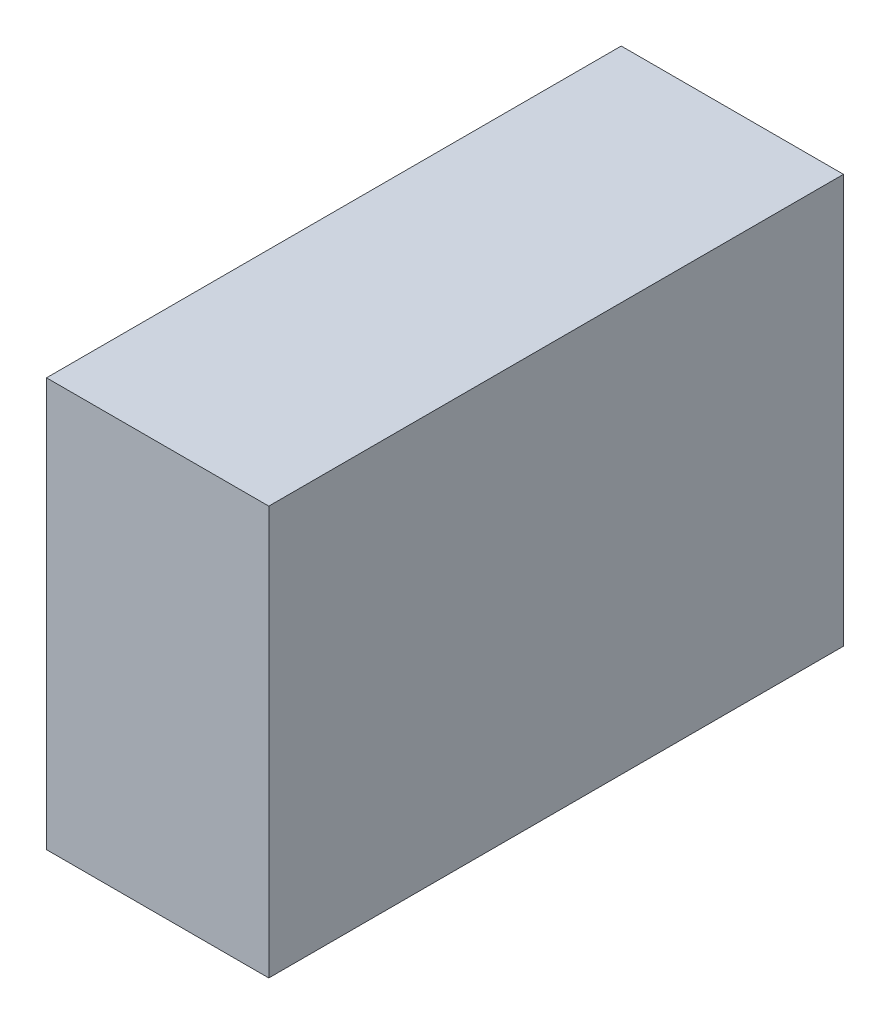
ISO-10303-21;
HEADER;
FILE_DESCRIPTION(('STEP AP214'),'2;1');
FILE_NAME('part.step','',(''),(''),'','','');
FILE_SCHEMA(('AUTOMOTIVE_DESIGN { 1 0 10303 214 1 1 1 1 }'));
ENDSEC;
DATA;
#1=APPLICATION_CONTEXT('core data for automotive mechanical design processes');
#2=APPLICATION_PROTOCOL_DEFINITION('international standard','automotive_design',2000,#1);
#3=PRODUCT_CONTEXT('',#1,'mechanical');
#4=PRODUCT('Part','Part','',(#3));
#5=PRODUCT_RELATED_PRODUCT_CATEGORY('part','',(#4));
#6=PRODUCT_DEFINITION_FORMATION('','',#4);
#7=PRODUCT_DEFINITION_CONTEXT('part definition',#1,'design');
#8=PRODUCT_DEFINITION('design','',#6,#7);
#9=PRODUCT_DEFINITION_SHAPE('','',#8);
#10=(LENGTH_UNIT() NAMED_UNIT(*) SI_UNIT(.MILLI.,.METRE.));
#11=(NAMED_UNIT(*) PLANE_ANGLE_UNIT() SI_UNIT($,.RADIAN.));
#12=(NAMED_UNIT(*) SI_UNIT($,.STERADIAN.) SOLID_ANGLE_UNIT());
#13=UNCERTAINTY_MEASURE_WITH_UNIT(LENGTH_MEASURE(1.E-05),#10,'distance_accuracy_value','');
#14=(GEOMETRIC_REPRESENTATION_CONTEXT(3) GLOBAL_UNCERTAINTY_ASSIGNED_CONTEXT((#13)) GLOBAL_UNIT_ASSIGNED_CONTEXT((#10,
#11,#12)) REPRESENTATION_CONTEXT('',''));
#15=CARTESIAN_POINT('',(0.,0.,0.));
#16=DIRECTION('',(0.,0.,1.));
#17=DIRECTION('',(1.,0.,0.));
#18=AXIS2_PLACEMENT_3D('',#15,#16,#17);
#19=CARTESIAN_POINT('',(12.7,67.8836515493127,-371.38835696242));
#20=DIRECTION('',(0.,0.,1.));
#21=DIRECTION('',(1.,0.,0.));
#22=AXIS2_PLACEMENT_3D('',#19,#20,#21);
#23=PLANE('',#22);
#24=DIRECTION('',(0.,1.,0.));
#25=VECTOR('',#24,1.);
#26=CARTESIAN_POINT('',(-12.7,67.8836515493127,-371.38835696242));
#27=LINE('',#26,#25);
#28=CARTESIAN_POINT('',(-12.7,67.8836515493127,-371.38835696242));
#29=VERTEX_POINT('',#28);
#30=CARTESIAN_POINT('',(-12.7,114.5867289811,-371.38835696242));
#31=VERTEX_POINT('',#30);
#32=EDGE_CURVE('E113',#29,#31,#27,.T.);
#33=ORIENTED_EDGE('',*,*,#32,.T.);
#34=DIRECTION('',(-1.,0.,0.));
#35=VECTOR('',#34,1.);
#36=CARTESIAN_POINT('',(12.7,114.5867289811,-371.38835696242));
#37=LINE('',#36,#35);
#38=CARTESIAN_POINT('',(12.7,114.5867289811,-371.38835696242));
#39=VERTEX_POINT('',#38);
#40=EDGE_CURVE('E11',#39,#31,#37,.T.);
#41=ORIENTED_EDGE('',*,*,#40,.F.);
#42=DIRECTION('',(0.,1.,0.));
#43=VECTOR('',#42,1.);
#44=CARTESIAN_POINT('',(12.7,67.8836515493127,-371.38835696242));
#45=LINE('',#44,#43);
#46=CARTESIAN_POINT('',(12.7,67.8836515493127,-371.38835696242));
#47=VERTEX_POINT('',#46);
#48=EDGE_CURVE('E97',#47,#39,#45,.T.);
#49=ORIENTED_EDGE('',*,*,#48,.F.);
#50=DIRECTION('',(-1.,0.,0.));
#51=VECTOR('',#50,1.);
#52=CARTESIAN_POINT('',(12.7,67.8836515493127,-371.38835696242));
#53=LINE('',#52,#51);
#54=EDGE_CURVE('E109',#47,#29,#53,.T.);
#55=ORIENTED_EDGE('',*,*,#54,.T.);
#56=EDGE_LOOP('',(#33,#41,#49,#55));
#57=FACE_BOUND('',#56,.T.);
#58=ADVANCED_FACE('F45',(#57),#23,.F.);
#59=CARTESIAN_POINT('',(12.7,114.5867289811,-371.38835696242));
#60=DIRECTION('',(0.,-1.,0.));
#61=DIRECTION('',(0.,0.,-1.));
#62=AXIS2_PLACEMENT_3D('',#59,#60,#61);
#63=PLANE('',#62);
#64=DIRECTION('',(0.,0.,1.));
#65=VECTOR('',#64,1.);
#66=CARTESIAN_POINT('',(-12.7,114.5867289811,-371.38835696242));
#67=LINE('',#66,#65);
#68=CARTESIAN_POINT('',(-12.7,114.5867289811,-305.712154323969));
#69=VERTEX_POINT('',#68);
#70=EDGE_CURVE('E102',#31,#69,#67,.T.);
#71=ORIENTED_EDGE('',*,*,#70,.T.);
#72=DIRECTION('',(-1.,0.,0.));
#73=VECTOR('',#72,1.);
#74=CARTESIAN_POINT('',(12.7,114.5867289811,-305.712154323969));
#75=LINE('',#74,#73);
#76=CARTESIAN_POINT('',(12.7,114.5867289811,-305.712154323969));
#77=VERTEX_POINT('',#76);
#78=EDGE_CURVE('E54',#77,#69,#75,.T.);
#79=ORIENTED_EDGE('',*,*,#78,.F.);
#80=DIRECTION('',(0.,0.,1.));
#81=VECTOR('',#80,1.);
#82=CARTESIAN_POINT('',(12.7,114.5867289811,-371.38835696242));
#83=LINE('',#82,#81);
#84=EDGE_CURVE('E92',#39,#77,#83,.T.);
#85=ORIENTED_EDGE('',*,*,#84,.F.);
#86=ORIENTED_EDGE('',*,*,#40,.T.);
#87=EDGE_LOOP('',(#71,#79,#85,#86));
#88=FACE_BOUND('',#87,.T.);
#89=ADVANCED_FACE('F101',(#88),#63,.F.);
#90=CARTESIAN_POINT('',(12.7,67.8836515493127,-305.712154323969));
#91=DIRECTION('',(0.,0.,-1.));
#92=DIRECTION('',(-1.,0.,0.));
#93=AXIS2_PLACEMENT_3D('',#90,#91,#92);
#94=PLANE('',#93);
#95=DIRECTION('',(0.,-1.,0.));
#96=VECTOR('',#95,1.);
#97=CARTESIAN_POINT('',(-12.7,67.8836515493127,-305.712154323969));
#98=LINE('',#97,#96);
#99=CARTESIAN_POINT('',(-12.7,67.8836515493127,-305.712154323969));
#100=VERTEX_POINT('',#99);
#101=EDGE_CURVE('E79',#69,#100,#98,.T.);
#102=ORIENTED_EDGE('',*,*,#101,.T.);
#103=DIRECTION('',(-1.,0.,0.));
#104=VECTOR('',#103,1.);
#105=CARTESIAN_POINT('',(12.7,67.8836515493127,-305.712154323969));
#106=LINE('',#105,#104);
#107=CARTESIAN_POINT('',(12.7,67.8836515493127,-305.712154323969));
#108=VERTEX_POINT('',#107);
#109=EDGE_CURVE('E104',#108,#100,#106,.T.);
#110=ORIENTED_EDGE('',*,*,#109,.F.);
#111=DIRECTION('',(0.,-1.,0.));
#112=VECTOR('',#111,1.);
#113=CARTESIAN_POINT('',(12.7,67.8836515493127,-305.712154323969));
#114=LINE('',#113,#112);
#115=EDGE_CURVE('E95',#77,#108,#114,.T.);
#116=ORIENTED_EDGE('',*,*,#115,.F.);
#117=ORIENTED_EDGE('',*,*,#78,.T.);
#118=EDGE_LOOP('',(#102,#110,#116,#117));
#119=FACE_BOUND('',#118,.T.);
#120=ADVANCED_FACE('F105',(#119),#94,.F.);
#121=CARTESIAN_POINT('',(12.7,67.8836515493127,-371.38835696242));
#122=DIRECTION('',(0.,1.,0.));
#123=DIRECTION('',(0.,0.,1.));
#124=AXIS2_PLACEMENT_3D('',#121,#122,#123);
#125=PLANE('',#124);
#126=DIRECTION('',(0.,0.,-1.));
#127=VECTOR('',#126,1.);
#128=CARTESIAN_POINT('',(-12.7,67.8836515493127,-371.38835696242));
#129=LINE('',#128,#127);
#130=EDGE_CURVE('E85',#100,#29,#129,.T.);
#131=ORIENTED_EDGE('',*,*,#130,.T.);
#132=ORIENTED_EDGE('',*,*,#54,.F.);
#133=DIRECTION('',(0.,0.,-1.));
#134=VECTOR('',#133,1.);
#135=CARTESIAN_POINT('',(12.7,67.8836515493127,-371.38835696242));
#136=LINE('',#135,#134);
#137=EDGE_CURVE('E62',#108,#47,#136,.T.);
#138=ORIENTED_EDGE('',*,*,#137,.F.);
#139=ORIENTED_EDGE('',*,*,#109,.T.);
#140=EDGE_LOOP('',(#131,#132,#138,#139));
#141=FACE_BOUND('',#140,.T.);
#142=ADVANCED_FACE('F126',(#141),#125,.F.);
#143=CARTESIAN_POINT('',(12.7,0.,0.));
#144=DIRECTION('',(1.,0.,0.));
#145=DIRECTION('',(0.,0.,-1.));
#146=AXIS2_PLACEMENT_3D('',#143,#144,#145);
#147=PLANE('',#146);
#148=ORIENTED_EDGE('',*,*,#48,.T.);
#149=ORIENTED_EDGE('',*,*,#84,.T.);
#150=ORIENTED_EDGE('',*,*,#115,.T.);
#151=ORIENTED_EDGE('',*,*,#137,.T.);
#152=EDGE_LOOP('',(#148,#149,#150,#151));
#153=FACE_BOUND('',#152,.T.);
#154=ADVANCED_FACE('F93',(#153),#147,.T.);
#155=CARTESIAN_POINT('',(-12.7,0.,0.));
#156=DIRECTION('',(1.,0.,0.));
#157=DIRECTION('',(0.,0.,-1.));
#158=AXIS2_PLACEMENT_3D('',#155,#156,#157);
#159=PLANE('',#158);
#160=ORIENTED_EDGE('',*,*,#32,.F.);
#161=ORIENTED_EDGE('',*,*,#130,.F.);
#162=ORIENTED_EDGE('',*,*,#101,.F.);
#163=ORIENTED_EDGE('',*,*,#70,.F.);
#164=EDGE_LOOP('',(#160,#161,#162,#163));
#165=FACE_BOUND('',#164,.T.);
#166=ADVANCED_FACE('F129',(#165),#159,.F.);
#167=CLOSED_SHELL('',(#58,#89,#120,#142,#154,#166));
#168=MANIFOLD_SOLID_BREP('B2',#167);
#169=ADVANCED_BREP_SHAPE_REPRESENTATION('',(#18,#168),#14);
#170=SHAPE_DEFINITION_REPRESENTATION(#9,#169);
ENDSEC;
END-ISO-10303-21;
